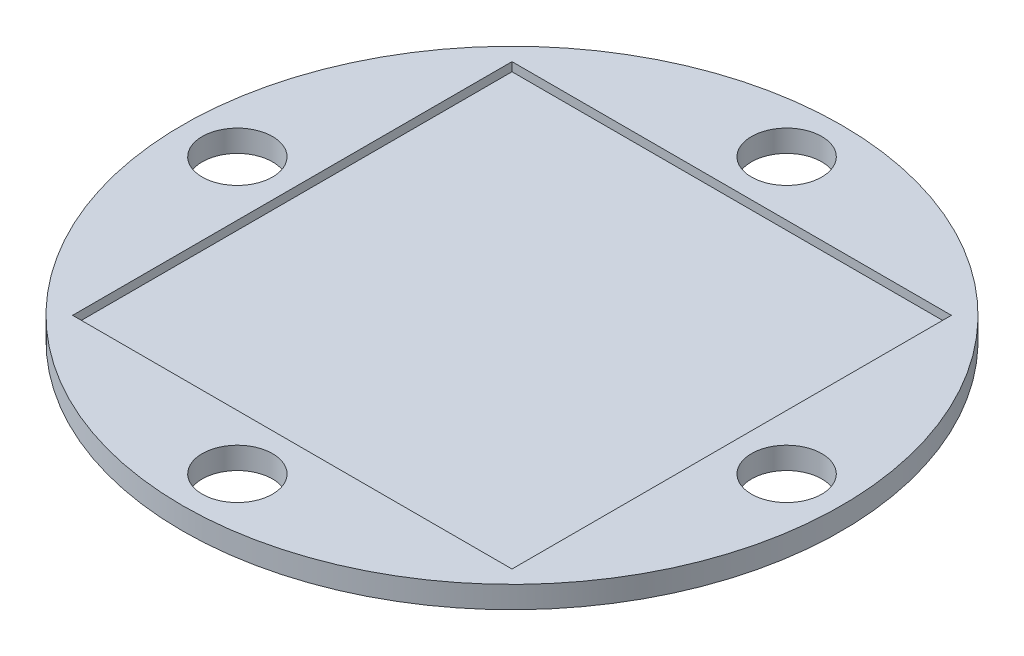
ISO-10303-21;
HEADER;
FILE_DESCRIPTION(('STEP AP214'),'2;1');
FILE_NAME('part.step','',(''),(''),'','','');
FILE_SCHEMA(('AUTOMOTIVE_DESIGN { 1 0 10303 214 1 1 1 1 }'));
ENDSEC;
DATA;
#1=APPLICATION_CONTEXT('core data for automotive mechanical design processes');
#2=APPLICATION_PROTOCOL_DEFINITION('international standard','automotive_design',2000,#1);
#3=PRODUCT_CONTEXT('',#1,'mechanical');
#4=PRODUCT('Part','Part','',(#3));
#5=PRODUCT_RELATED_PRODUCT_CATEGORY('part','',(#4));
#6=PRODUCT_DEFINITION_FORMATION('','',#4);
#7=PRODUCT_DEFINITION_CONTEXT('part definition',#1,'design');
#8=PRODUCT_DEFINITION('design','',#6,#7);
#9=PRODUCT_DEFINITION_SHAPE('','',#8);
#10=(LENGTH_UNIT() NAMED_UNIT(*) SI_UNIT(.MILLI.,.METRE.));
#11=(NAMED_UNIT(*) PLANE_ANGLE_UNIT() SI_UNIT($,.RADIAN.));
#12=(NAMED_UNIT(*) SI_UNIT($,.STERADIAN.) SOLID_ANGLE_UNIT());
#13=UNCERTAINTY_MEASURE_WITH_UNIT(LENGTH_MEASURE(1.E-05),#10,'distance_accuracy_value','');
#14=(GEOMETRIC_REPRESENTATION_CONTEXT(3) GLOBAL_UNCERTAINTY_ASSIGNED_CONTEXT((#13)) GLOBAL_UNIT_ASSIGNED_CONTEXT((#10,
#11,#12)) REPRESENTATION_CONTEXT('',''));
#15=CARTESIAN_POINT('',(0.,0.,0.));
#16=DIRECTION('',(0.,0.,1.));
#17=DIRECTION('',(1.,0.,0.));
#18=AXIS2_PLACEMENT_3D('',#15,#16,#17);
#19=CARTESIAN_POINT('',(0.,5.,0.));
#20=DIRECTION('',(0.,-1.,0.));
#21=DIRECTION('',(0.,0.,-1.));
#22=AXIS2_PLACEMENT_3D('',#19,#20,#21);
#23=CYLINDRICAL_SURFACE('',#22,75.);
#24=CARTESIAN_POINT('',(0.,5.,0.));
#25=DIRECTION('',(0.,1.,0.));
#26=DIRECTION('',(0.,0.,1.));
#27=AXIS2_PLACEMENT_3D('',#24,#25,#26);
#28=CIRCLE('',#27,75.);
#29=CARTESIAN_POINT('',(0.,5.,75.));
#30=VERTEX_POINT('',#29);
#31=EDGE_CURVE('E12',#30,#30,#28,.T.);
#32=ORIENTED_EDGE('',*,*,#31,.F.);
#33=EDGE_LOOP('',(#32));
#34=FACE_BOUND('',#33,.T.);
#35=CARTESIAN_POINT('',(0.,0.,0.));
#36=DIRECTION('',(0.,1.,0.));
#37=DIRECTION('',(0.,0.,1.));
#38=AXIS2_PLACEMENT_3D('',#35,#36,#37);
#39=CIRCLE('',#38,75.);
#40=CARTESIAN_POINT('',(0.,0.,75.));
#41=VERTEX_POINT('',#40);
#42=EDGE_CURVE('E55',#41,#41,#39,.T.);
#43=ORIENTED_EDGE('',*,*,#42,.T.);
#44=EDGE_LOOP('',(#43));
#45=FACE_BOUND('',#44,.T.);
#46=ADVANCED_FACE('F47',(#34,#45),#23,.T.);
#47=CARTESIAN_POINT('',(0.,5.,0.));
#48=DIRECTION('',(0.,1.,0.));
#49=DIRECTION('',(0.,0.,1.));
#50=AXIS2_PLACEMENT_3D('',#47,#48,#49);
#51=PLANE('',#50);
#52=CARTESIAN_POINT('',(0.,5.,-62.5));
#53=DIRECTION('',(0.,1.,0.));
#54=DIRECTION('',(0.,0.,1.));
#55=AXIS2_PLACEMENT_3D('',#52,#53,#54);
#56=CIRCLE('',#55,8.);
#57=CARTESIAN_POINT('',(0.,5.,-54.5));
#58=VERTEX_POINT('',#57);
#59=EDGE_CURVE('E133',#58,#58,#56,.T.);
#60=ORIENTED_EDGE('',*,*,#59,.F.);
#61=EDGE_LOOP('',(#60));
#62=FACE_BOUND('',#61,.T.);
#63=CARTESIAN_POINT('',(62.5,5.,0.));
#64=DIRECTION('',(0.,1.,0.));
#65=DIRECTION('',(0.,0.,1.));
#66=AXIS2_PLACEMENT_3D('',#63,#64,#65);
#67=CIRCLE('',#66,8.00000000000001);
#68=CARTESIAN_POINT('',(62.5,5.,8.00000000000001));
#69=VERTEX_POINT('',#68);
#70=EDGE_CURVE('E202',#69,#69,#67,.T.);
#71=ORIENTED_EDGE('',*,*,#70,.F.);
#72=EDGE_LOOP('',(#71));
#73=FACE_BOUND('',#72,.T.);
#74=CARTESIAN_POINT('',(0.,5.,62.5));
#75=DIRECTION('',(0.,1.,0.));
#76=DIRECTION('',(0.,0.,1.));
#77=AXIS2_PLACEMENT_3D('',#74,#75,#76);
#78=CIRCLE('',#77,8.);
#79=CARTESIAN_POINT('',(0.,5.,70.5));
#80=VERTEX_POINT('',#79);
#81=EDGE_CURVE('E195',#80,#80,#78,.T.);
#82=ORIENTED_EDGE('',*,*,#81,.F.);
#83=EDGE_LOOP('',(#82));
#84=FACE_BOUND('',#83,.T.);
#85=CARTESIAN_POINT('',(-62.5,5.,0.));
#86=DIRECTION('',(0.,1.,0.));
#87=DIRECTION('',(0.,0.,1.));
#88=AXIS2_PLACEMENT_3D('',#85,#86,#87);
#89=CIRCLE('',#88,8.);
#90=CARTESIAN_POINT('',(-62.5,5.,8.));
#91=VERTEX_POINT('',#90);
#92=EDGE_CURVE('E203',#91,#91,#89,.T.);
#93=ORIENTED_EDGE('',*,*,#92,.F.);
#94=EDGE_LOOP('',(#93));
#95=FACE_BOUND('',#94,.T.);
#96=DIRECTION('',(0.,0.,-1.));
#97=VECTOR('',#96,1.);
#98=CARTESIAN_POINT('',(50.,5.,50.));
#99=LINE('',#98,#97);
#100=CARTESIAN_POINT('',(50.,5.,50.));
#101=VERTEX_POINT('',#100);
#102=CARTESIAN_POINT('',(50.,5.,-50.));
#103=VERTEX_POINT('',#102);
#104=EDGE_CURVE('E63',#101,#103,#99,.T.);
#105=ORIENTED_EDGE('',*,*,#104,.F.);
#106=DIRECTION('',(1.,0.,0.));
#107=VECTOR('',#106,1.);
#108=CARTESIAN_POINT('',(-50.,5.,50.));
#109=LINE('',#108,#107);
#110=CARTESIAN_POINT('',(-50.,5.,50.));
#111=VERTEX_POINT('',#110);
#112=EDGE_CURVE('E114',#111,#101,#109,.T.);
#113=ORIENTED_EDGE('',*,*,#112,.F.);
#114=DIRECTION('',(0.,0.,1.));
#115=VECTOR('',#114,1.);
#116=CARTESIAN_POINT('',(-50.,5.,50.));
#117=LINE('',#116,#115);
#118=CARTESIAN_POINT('',(-50.,5.,-50.));
#119=VERTEX_POINT('',#118);
#120=EDGE_CURVE('E121',#119,#111,#117,.T.);
#121=ORIENTED_EDGE('',*,*,#120,.F.);
#122=DIRECTION('',(-1.,0.,0.));
#123=VECTOR('',#122,1.);
#124=CARTESIAN_POINT('',(-50.,5.,-50.));
#125=LINE('',#124,#123);
#126=EDGE_CURVE('E98',#103,#119,#125,.T.);
#127=ORIENTED_EDGE('',*,*,#126,.F.);
#128=EDGE_LOOP('',(#105,#113,#121,#127));
#129=FACE_BOUND('',#128,.T.);
#130=ORIENTED_EDGE('',*,*,#31,.T.);
#131=EDGE_LOOP('',(#130));
#132=FACE_BOUND('',#131,.T.);
#133=ADVANCED_FACE('F157',(#62,#73,#84,#95,#129,#132),#51,.T.);
#134=CARTESIAN_POINT('',(0.,0.,0.));
#135=DIRECTION('',(0.,1.,0.));
#136=DIRECTION('',(0.,0.,1.));
#137=AXIS2_PLACEMENT_3D('',#134,#135,#136);
#138=PLANE('',#137);
#139=CARTESIAN_POINT('',(0.,0.,-62.5));
#140=DIRECTION('',(0.,1.,0.));
#141=DIRECTION('',(0.,0.,1.));
#142=AXIS2_PLACEMENT_3D('',#139,#140,#141);
#143=CIRCLE('',#142,8.);
#144=CARTESIAN_POINT('',(0.,0.,-54.5));
#145=VERTEX_POINT('',#144);
#146=EDGE_CURVE('E50',#145,#145,#143,.T.);
#147=ORIENTED_EDGE('',*,*,#146,.T.);
#148=EDGE_LOOP('',(#147));
#149=FACE_BOUND('',#148,.T.);
#150=CARTESIAN_POINT('',(62.5,0.,0.));
#151=DIRECTION('',(0.,1.,0.));
#152=DIRECTION('',(0.,0.,1.));
#153=AXIS2_PLACEMENT_3D('',#150,#151,#152);
#154=CIRCLE('',#153,8.00000000000001);
#155=CARTESIAN_POINT('',(62.5,0.,8.00000000000001));
#156=VERTEX_POINT('',#155);
#157=EDGE_CURVE('E135',#156,#156,#154,.T.);
#158=ORIENTED_EDGE('',*,*,#157,.T.);
#159=EDGE_LOOP('',(#158));
#160=FACE_BOUND('',#159,.T.);
#161=CARTESIAN_POINT('',(0.,0.,62.5));
#162=DIRECTION('',(0.,1.,0.));
#163=DIRECTION('',(0.,0.,1.));
#164=AXIS2_PLACEMENT_3D('',#161,#162,#163);
#165=CIRCLE('',#164,8.);
#166=CARTESIAN_POINT('',(0.,0.,70.5));
#167=VERTEX_POINT('',#166);
#168=EDGE_CURVE('E132',#167,#167,#165,.T.);
#169=ORIENTED_EDGE('',*,*,#168,.T.);
#170=EDGE_LOOP('',(#169));
#171=FACE_BOUND('',#170,.T.);
#172=CARTESIAN_POINT('',(-62.5,0.,0.));
#173=DIRECTION('',(0.,1.,0.));
#174=DIRECTION('',(0.,0.,1.));
#175=AXIS2_PLACEMENT_3D('',#172,#173,#174);
#176=CIRCLE('',#175,8.);
#177=CARTESIAN_POINT('',(-62.5,0.,8.));
#178=VERTEX_POINT('',#177);
#179=EDGE_CURVE('E129',#178,#178,#176,.T.);
#180=ORIENTED_EDGE('',*,*,#179,.T.);
#181=EDGE_LOOP('',(#180));
#182=FACE_BOUND('',#181,.T.);
#183=ORIENTED_EDGE('',*,*,#42,.F.);
#184=EDGE_LOOP('',(#183));
#185=FACE_BOUND('',#184,.T.);
#186=ADVANCED_FACE('F142',(#149,#160,#171,#182,#185),#138,.F.);
#187=CARTESIAN_POINT('',(50.,3.,50.));
#188=DIRECTION('',(1.,0.,0.));
#189=DIRECTION('',(0.,0.,-1.));
#190=AXIS2_PLACEMENT_3D('',#187,#188,#189);
#191=PLANE('',#190);
#192=ORIENTED_EDGE('',*,*,#104,.T.);
#193=DIRECTION('',(0.,1.,0.));
#194=VECTOR('',#193,1.);
#195=CARTESIAN_POINT('',(50.,3.,-50.));
#196=LINE('',#195,#194);
#197=CARTESIAN_POINT('',(50.,3.,-50.));
#198=VERTEX_POINT('',#197);
#199=EDGE_CURVE('E86',#198,#103,#196,.T.);
#200=ORIENTED_EDGE('',*,*,#199,.F.);
#201=DIRECTION('',(0.,0.,-1.));
#202=VECTOR('',#201,1.);
#203=CARTESIAN_POINT('',(50.,3.,50.));
#204=LINE('',#203,#202);
#205=CARTESIAN_POINT('',(50.,3.,50.));
#206=VERTEX_POINT('',#205);
#207=EDGE_CURVE('E112',#206,#198,#204,.T.);
#208=ORIENTED_EDGE('',*,*,#207,.F.);
#209=DIRECTION('',(0.,1.,0.));
#210=VECTOR('',#209,1.);
#211=CARTESIAN_POINT('',(50.,3.,50.));
#212=LINE('',#211,#210);
#213=EDGE_CURVE('E71',#206,#101,#212,.T.);
#214=ORIENTED_EDGE('',*,*,#213,.T.);
#215=EDGE_LOOP('',(#192,#200,#208,#214));
#216=FACE_BOUND('',#215,.T.);
#217=ADVANCED_FACE('F169',(#216),#191,.F.);
#218=CARTESIAN_POINT('',(-50.,3.,50.));
#219=DIRECTION('',(0.,0.,1.));
#220=DIRECTION('',(1.,0.,0.));
#221=AXIS2_PLACEMENT_3D('',#218,#219,#220);
#222=PLANE('',#221);
#223=ORIENTED_EDGE('',*,*,#112,.T.);
#224=ORIENTED_EDGE('',*,*,#213,.F.);
#225=DIRECTION('',(1.,0.,0.));
#226=VECTOR('',#225,1.);
#227=CARTESIAN_POINT('',(-50.,3.,50.));
#228=LINE('',#227,#226);
#229=CARTESIAN_POINT('',(-50.,3.,50.));
#230=VERTEX_POINT('',#229);
#231=EDGE_CURVE('E109',#230,#206,#228,.T.);
#232=ORIENTED_EDGE('',*,*,#231,.F.);
#233=DIRECTION('',(0.,1.,0.));
#234=VECTOR('',#233,1.);
#235=CARTESIAN_POINT('',(-50.,3.,50.));
#236=LINE('',#235,#234);
#237=EDGE_CURVE('E102',#230,#111,#236,.T.);
#238=ORIENTED_EDGE('',*,*,#237,.T.);
#239=EDGE_LOOP('',(#223,#224,#232,#238));
#240=FACE_BOUND('',#239,.T.);
#241=ADVANCED_FACE('F173',(#240),#222,.F.);
#242=CARTESIAN_POINT('',(-50.,3.,50.));
#243=DIRECTION('',(-1.,0.,0.));
#244=DIRECTION('',(0.,0.,1.));
#245=AXIS2_PLACEMENT_3D('',#242,#243,#244);
#246=PLANE('',#245);
#247=ORIENTED_EDGE('',*,*,#120,.T.);
#248=ORIENTED_EDGE('',*,*,#237,.F.);
#249=DIRECTION('',(0.,0.,1.));
#250=VECTOR('',#249,1.);
#251=CARTESIAN_POINT('',(-50.,3.,50.));
#252=LINE('',#251,#250);
#253=CARTESIAN_POINT('',(-50.,3.,-50.));
#254=VERTEX_POINT('',#253);
#255=EDGE_CURVE('E105',#254,#230,#252,.T.);
#256=ORIENTED_EDGE('',*,*,#255,.F.);
#257=DIRECTION('',(0.,1.,0.));
#258=VECTOR('',#257,1.);
#259=CARTESIAN_POINT('',(-50.,3.,-50.));
#260=LINE('',#259,#258);
#261=EDGE_CURVE('E91',#254,#119,#260,.T.);
#262=ORIENTED_EDGE('',*,*,#261,.T.);
#263=EDGE_LOOP('',(#247,#248,#256,#262));
#264=FACE_BOUND('',#263,.T.);
#265=ADVANCED_FACE('F106',(#264),#246,.F.);
#266=CARTESIAN_POINT('',(-50.,3.,-50.));
#267=DIRECTION('',(0.,0.,-1.));
#268=DIRECTION('',(-1.,0.,0.));
#269=AXIS2_PLACEMENT_3D('',#266,#267,#268);
#270=PLANE('',#269);
#271=ORIENTED_EDGE('',*,*,#126,.T.);
#272=ORIENTED_EDGE('',*,*,#261,.F.);
#273=DIRECTION('',(-1.,0.,0.));
#274=VECTOR('',#273,1.);
#275=CARTESIAN_POINT('',(-50.,3.,-50.));
#276=LINE('',#275,#274);
#277=EDGE_CURVE('E95',#198,#254,#276,.T.);
#278=ORIENTED_EDGE('',*,*,#277,.F.);
#279=ORIENTED_EDGE('',*,*,#199,.T.);
#280=EDGE_LOOP('',(#271,#272,#278,#279));
#281=FACE_BOUND('',#280,.T.);
#282=ADVANCED_FACE('F93',(#281),#270,.F.);
#283=CARTESIAN_POINT('',(0.,3.,0.));
#284=DIRECTION('',(0.,-1.,0.));
#285=DIRECTION('',(0.,0.,-1.));
#286=AXIS2_PLACEMENT_3D('',#283,#284,#285);
#287=PLANE('',#286);
#288=ORIENTED_EDGE('',*,*,#207,.T.);
#289=ORIENTED_EDGE('',*,*,#277,.T.);
#290=ORIENTED_EDGE('',*,*,#255,.T.);
#291=ORIENTED_EDGE('',*,*,#231,.T.);
#292=EDGE_LOOP('',(#288,#289,#290,#291));
#293=FACE_BOUND('',#292,.T.);
#294=ADVANCED_FACE('F111',(#293),#287,.F.);
#295=CARTESIAN_POINT('',(-62.5,-5.,0.));
#296=DIRECTION('',(0.,1.,0.));
#297=DIRECTION('',(0.,0.,1.));
#298=AXIS2_PLACEMENT_3D('',#295,#296,#297);
#299=CYLINDRICAL_SURFACE('',#298,8.);
#300=ORIENTED_EDGE('',*,*,#92,.T.);
#301=EDGE_LOOP('',(#300));
#302=FACE_BOUND('',#301,.T.);
#303=ORIENTED_EDGE('',*,*,#179,.F.);
#304=EDGE_LOOP('',(#303));
#305=FACE_BOUND('',#304,.T.);
#306=ADVANCED_FACE('F184',(#302,#305),#299,.F.);
#307=CARTESIAN_POINT('',(0.,-5.,62.5));
#308=DIRECTION('',(0.,1.,0.));
#309=DIRECTION('',(0.,0.,1.));
#310=AXIS2_PLACEMENT_3D('',#307,#308,#309);
#311=CYLINDRICAL_SURFACE('',#310,8.);
#312=ORIENTED_EDGE('',*,*,#81,.T.);
#313=EDGE_LOOP('',(#312));
#314=FACE_BOUND('',#313,.T.);
#315=ORIENTED_EDGE('',*,*,#168,.F.);
#316=EDGE_LOOP('',(#315));
#317=FACE_BOUND('',#316,.T.);
#318=ADVANCED_FACE('F152',(#314,#317),#311,.F.);
#319=CARTESIAN_POINT('',(62.5,-5.,0.));
#320=DIRECTION('',(0.,1.,0.));
#321=DIRECTION('',(0.,0.,1.));
#322=AXIS2_PLACEMENT_3D('',#319,#320,#321);
#323=CYLINDRICAL_SURFACE('',#322,8.00000000000001);
#324=ORIENTED_EDGE('',*,*,#70,.T.);
#325=EDGE_LOOP('',(#324));
#326=FACE_BOUND('',#325,.T.);
#327=ORIENTED_EDGE('',*,*,#157,.F.);
#328=EDGE_LOOP('',(#327));
#329=FACE_BOUND('',#328,.T.);
#330=ADVANCED_FACE('F146',(#326,#329),#323,.F.);
#331=CARTESIAN_POINT('',(0.,-5.,-62.5));
#332=DIRECTION('',(0.,1.,0.));
#333=DIRECTION('',(0.,0.,1.));
#334=AXIS2_PLACEMENT_3D('',#331,#332,#333);
#335=CYLINDRICAL_SURFACE('',#334,8.);
#336=ORIENTED_EDGE('',*,*,#59,.T.);
#337=EDGE_LOOP('',(#336));
#338=FACE_BOUND('',#337,.T.);
#339=ORIENTED_EDGE('',*,*,#146,.F.);
#340=EDGE_LOOP('',(#339));
#341=FACE_BOUND('',#340,.T.);
#342=ADVANCED_FACE('F144',(#338,#341),#335,.F.);
#343=CLOSED_SHELL('',(#46,#133,#186,#217,#241,#265,#282,#294,#306,#318,#330,#342));
#344=MANIFOLD_SOLID_BREP('B2',#343);
#345=ADVANCED_BREP_SHAPE_REPRESENTATION('',(#18,#344),#14);
#346=SHAPE_DEFINITION_REPRESENTATION(#9,#345);
ENDSEC;
END-ISO-10303-21;
